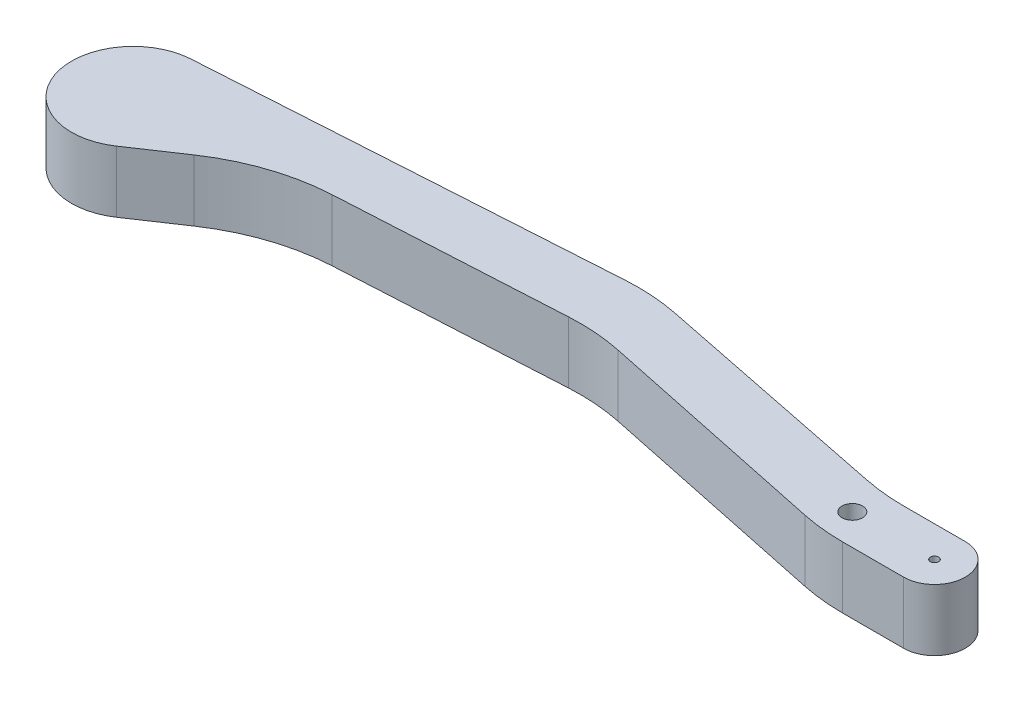
ISO-10303-21;
HEADER;
FILE_DESCRIPTION(('STEP AP214'),'2;1');
FILE_NAME('part.step','',(''),(''),'','','');
FILE_SCHEMA(('AUTOMOTIVE_DESIGN { 1 0 10303 214 1 1 1 1 }'));
ENDSEC;
DATA;
#1=APPLICATION_CONTEXT('core data for automotive mechanical design processes');
#2=APPLICATION_PROTOCOL_DEFINITION('international standard','automotive_design',2000,#1);
#3=PRODUCT_CONTEXT('',#1,'mechanical');
#4=PRODUCT('Part','Part','',(#3));
#5=PRODUCT_RELATED_PRODUCT_CATEGORY('part','',(#4));
#6=PRODUCT_DEFINITION_FORMATION('','',#4);
#7=PRODUCT_DEFINITION_CONTEXT('part definition',#1,'design');
#8=PRODUCT_DEFINITION('design','',#6,#7);
#9=PRODUCT_DEFINITION_SHAPE('','',#8);
#10=(LENGTH_UNIT() NAMED_UNIT(*) SI_UNIT(.MILLI.,.METRE.));
#11=(NAMED_UNIT(*) PLANE_ANGLE_UNIT() SI_UNIT($,.RADIAN.));
#12=(NAMED_UNIT(*) SI_UNIT($,.STERADIAN.) SOLID_ANGLE_UNIT());
#13=UNCERTAINTY_MEASURE_WITH_UNIT(LENGTH_MEASURE(1.E-05),#10,'distance_accuracy_value','');
#14=(GEOMETRIC_REPRESENTATION_CONTEXT(3) GLOBAL_UNCERTAINTY_ASSIGNED_CONTEXT((#13)) GLOBAL_UNIT_ASSIGNED_CONTEXT((#10,
#11,#12)) REPRESENTATION_CONTEXT('',''));
#15=CARTESIAN_POINT('',(0.,0.,0.));
#16=DIRECTION('',(0.,0.,1.));
#17=DIRECTION('',(1.,0.,0.));
#18=AXIS2_PLACEMENT_3D('',#15,#16,#17);
#19=CARTESIAN_POINT('',(-350.,30.,0.));
#20=DIRECTION('',(0.,-1.,0.));
#21=DIRECTION('',(0.,0.,-1.));
#22=AXIS2_PLACEMENT_3D('',#19,#20,#21);
#23=CYLINDRICAL_SURFACE('',#22,30.);
#24=CARTESIAN_POINT('',(-350.,0.,0.));
#25=DIRECTION('',(0.,1.,0.));
#26=DIRECTION('',(0.,0.,1.));
#27=AXIS2_PLACEMENT_3D('',#24,#25,#26);
#28=CIRCLE('',#27,30.);
#29=CARTESIAN_POINT('',(-351.875417006676,0.,-29.9413228006224));
#30=VERTEX_POINT('',#29);
#31=CARTESIAN_POINT('',(-333.28573951652,0.,24.9125168638253));
#32=VERTEX_POINT('',#31);
#33=EDGE_CURVE('E161',#30,#32,#28,.T.);
#34=ORIENTED_EDGE('',*,*,#33,.T.);
#35=DIRECTION('',(0.,-1.,0.));
#36=VECTOR('',#35,1.);
#37=CARTESIAN_POINT('',(-333.28573951652,30.,24.9125168638253));
#38=LINE('',#37,#36);
#39=CARTESIAN_POINT('',(-333.28573951652,30.,24.9125168638253));
#40=VERTEX_POINT('',#39);
#41=EDGE_CURVE('E142',#40,#32,#38,.T.);
#42=ORIENTED_EDGE('',*,*,#41,.F.);
#43=CARTESIAN_POINT('',(-350.,30.,0.));
#44=DIRECTION('',(0.,1.,0.));
#45=DIRECTION('',(0.,0.,1.));
#46=AXIS2_PLACEMENT_3D('',#43,#44,#45);
#47=CIRCLE('',#46,30.);
#48=CARTESIAN_POINT('',(-351.875417006676,30.,-29.9413228006224));
#49=VERTEX_POINT('',#48);
#50=EDGE_CURVE('E148',#49,#40,#47,.T.);
#51=ORIENTED_EDGE('',*,*,#50,.F.);
#52=DIRECTION('',(0.,-1.,0.));
#53=VECTOR('',#52,1.);
#54=CARTESIAN_POINT('',(-351.875417006676,30.,-29.9413228006224));
#55=LINE('',#54,#53);
#56=EDGE_CURVE('E243',#49,#30,#55,.T.);
#57=ORIENTED_EDGE('',*,*,#56,.T.);
#58=EDGE_LOOP('',(#34,#42,#51,#57));
#59=FACE_BOUND('',#58,.T.);
#60=ADVANCED_FACE('F35',(#59),#23,.T.);
#61=CARTESIAN_POINT('',(-91.9282686591511,30.,-137.018598309922));
#62=DIRECTION('',(-0.557142016116002,0.,-0.830417228794175));
#63=DIRECTION('',(-0.830417228794175,0.,0.557142016116002));
#64=AXIS2_PLACEMENT_3D('',#61,#62,#63);
#65=PLANE('',#64);
#66=DIRECTION('',(0.830417228794175,0.,-0.557142016116002));
#67=VECTOR('',#66,1.);
#68=CARTESIAN_POINT('',(-91.9282686591511,0.,-137.018598309922));
#69=LINE('',#68,#67);
#70=CARTESIAN_POINT('',(-310.608396728041,0.,9.69787530385566));
#71=VERTEX_POINT('',#70);
#72=EDGE_CURVE('E211',#32,#71,#69,.T.);
#73=ORIENTED_EDGE('',*,*,#72,.T.);
#74=DIRECTION('',(0.,-1.,0.));
#75=VECTOR('',#74,1.);
#76=CARTESIAN_POINT('',(-310.608396728041,30.,9.69787530385559));
#77=LINE('',#76,#75);
#78=CARTESIAN_POINT('',(-310.608396728041,30.,9.69787530385566));
#79=VERTEX_POINT('',#78);
#80=EDGE_CURVE('E145',#71,#79,#77,.F.);
#81=ORIENTED_EDGE('',*,*,#80,.T.);
#82=DIRECTION('',(0.830417228794175,0.,-0.557142016116002));
#83=VECTOR('',#82,1.);
#84=CARTESIAN_POINT('',(-91.9282686591511,30.,-137.018598309922));
#85=LINE('',#84,#83);
#86=EDGE_CURVE('E137',#40,#79,#85,.T.);
#87=ORIENTED_EDGE('',*,*,#86,.F.);
#88=ORIENTED_EDGE('',*,*,#41,.T.);
#89=EDGE_LOOP('',(#73,#81,#87,#88));
#90=FACE_BOUND('',#89,.T.);
#91=ADVANCED_FACE('F140',(#90),#65,.F.);
#92=CARTESIAN_POINT('',(-1.19004921764275,30.,-21.4737935567704));
#93=DIRECTION('',(-0.0553337702493512,0.,-0.998467913290153));
#94=DIRECTION('',(-0.998467913290153,0.,0.0553337702493512));
#95=AXIS2_PLACEMENT_3D('',#92,#93,#94);
#96=PLANE('',#95);
#97=DIRECTION('',(0.998467913290153,0.,-0.0553337702493512));
#98=VECTOR('',#97,1.);
#99=CARTESIAN_POINT('',(-1.19004921764275,0.,-21.4737935567704));
#100=LINE('',#99,#98);
#101=CARTESIAN_POINT('',(-260.427572141376,0.,-7.1071931457422));
#102=VERTEX_POINT('',#101);
#103=CARTESIAN_POINT('',(-151.198358450132,0.,-13.1605316000468));
#104=VERTEX_POINT('',#103);
#105=EDGE_CURVE('E213',#102,#104,#100,.T.);
#106=ORIENTED_EDGE('',*,*,#105,.T.);
#107=DIRECTION('',(0.,-1.,0.));
#108=VECTOR('',#107,1.);
#109=CARTESIAN_POINT('',(-151.198358450132,30.,-13.1605316000468));
#110=LINE('',#109,#108);
#111=CARTESIAN_POINT('',(-151.198358450132,30.,-13.1605316000468));
#112=VERTEX_POINT('',#111);
#113=EDGE_CURVE('E196',#104,#112,#110,.F.);
#114=ORIENTED_EDGE('',*,*,#113,.T.);
#115=DIRECTION('',(0.998467913290153,0.,-0.0553337702493512));
#116=VECTOR('',#115,1.);
#117=CARTESIAN_POINT('',(-1.19004921764275,30.,-21.4737935567704));
#118=LINE('',#117,#116);
#119=CARTESIAN_POINT('',(-260.427572141376,30.,-7.1071931457422));
#120=VERTEX_POINT('',#119);
#121=EDGE_CURVE('E147',#120,#112,#118,.T.);
#122=ORIENTED_EDGE('',*,*,#121,.F.);
#123=DIRECTION('',(0.,-1.,0.));
#124=VECTOR('',#123,1.);
#125=CARTESIAN_POINT('',(-260.427572141376,0.,-7.10719314574219));
#126=LINE('',#125,#124);
#127=EDGE_CURVE('E193',#120,#102,#126,.T.);
#128=ORIENTED_EDGE('',*,*,#127,.T.);
#129=EDGE_LOOP('',(#106,#114,#122,#128));
#130=FACE_BOUND('',#129,.T.);
#131=ADVANCED_FACE('F221',(#130),#96,.F.);
#132=CARTESIAN_POINT('',(-3.01378585704881,30.,14.3910568491865));
#133=DIRECTION('',(0.20497419413347,0.,-0.978767377745772));
#134=DIRECTION('',(-0.978767377745772,0.,-0.20497419413347));
#135=AXIS2_PLACEMENT_3D('',#132,#133,#134);
#136=PLANE('',#135);
#137=DIRECTION('',(0.978767377745772,0.,0.20497419413347));
#138=VECTOR('',#137,1.);
#139=CARTESIAN_POINT('',(-3.01378585704881,0.,14.3910568491865));
#140=LINE('',#139,#138);
#141=CARTESIAN_POINT('',(-125.16756201185,0.,-11.1904780456087));
#142=VERTEX_POINT('',#141);
#143=CARTESIAN_POINT('',(-10.2447746944077,0.,12.8767377745772));
#144=VERTEX_POINT('',#143);
#145=EDGE_CURVE('E246',#142,#144,#140,.T.);
#146=ORIENTED_EDGE('',*,*,#145,.T.);
#147=DIRECTION('',(0.,-1.,0.));
#148=VECTOR('',#147,1.);
#149=CARTESIAN_POINT('',(-10.2447746944077,30.,12.8767377745772));
#150=LINE('',#149,#148);
#151=CARTESIAN_POINT('',(-10.2447746944077,30.,12.8767377745772));
#152=VERTEX_POINT('',#151);
#153=EDGE_CURVE('E179',#144,#152,#150,.F.);
#154=ORIENTED_EDGE('',*,*,#153,.T.);
#155=DIRECTION('',(0.978767377745772,0.,0.20497419413347));
#156=VECTOR('',#155,1.);
#157=CARTESIAN_POINT('',(-3.01378585704881,30.,14.3910568491865));
#158=LINE('',#157,#156);
#159=CARTESIAN_POINT('',(-125.16756201185,30.,-11.1904780456087));
#160=VERTEX_POINT('',#159);
#161=EDGE_CURVE('E223',#160,#152,#158,.T.);
#162=ORIENTED_EDGE('',*,*,#161,.F.);
#163=DIRECTION('',(0.,-1.,0.));
#164=VECTOR('',#163,1.);
#165=CARTESIAN_POINT('',(-125.16756201185,0.,-11.1904780456087));
#166=LINE('',#165,#164);
#167=EDGE_CURVE('E176',#160,#142,#166,.T.);
#168=ORIENTED_EDGE('',*,*,#167,.T.);
#169=EDGE_LOOP('',(#146,#154,#162,#168));
#170=FACE_BOUND('',#169,.T.);
#171=ADVANCED_FACE('F327',(#170),#136,.F.);
#172=CARTESIAN_POINT('',(0.,30.,15.));
#173=DIRECTION('',(0.,0.,-1.));
#174=DIRECTION('',(-1.,0.,0.));
#175=AXIS2_PLACEMENT_3D('',#172,#173,#174);
#176=PLANE('',#175);
#177=DIRECTION('',(1.,0.,0.));
#178=VECTOR('',#177,1.);
#179=CARTESIAN_POINT('',(0.,30.,15.));
#180=LINE('',#179,#178);
#181=CARTESIAN_POINT('',(10.2526447189393,30.,15.));
#182=VERTEX_POINT('',#181);
#183=CARTESIAN_POINT('',(40.,30.,15.));
#184=VERTEX_POINT('',#183);
#185=EDGE_CURVE('E225',#182,#184,#180,.T.);
#186=ORIENTED_EDGE('',*,*,#185,.F.);
#187=DIRECTION('',(0.,-1.,0.));
#188=VECTOR('',#187,1.);
#189=CARTESIAN_POINT('',(10.2526447189393,30.,15.));
#190=LINE('',#189,#188);
#191=CARTESIAN_POINT('',(10.2526447189393,0.,15.));
#192=VERTEX_POINT('',#191);
#193=EDGE_CURVE('E162',#182,#192,#190,.T.);
#194=ORIENTED_EDGE('',*,*,#193,.T.);
#195=DIRECTION('',(1.,0.,0.));
#196=VECTOR('',#195,1.);
#197=CARTESIAN_POINT('',(0.,0.,15.));
#198=LINE('',#197,#196);
#199=CARTESIAN_POINT('',(40.,0.,15.));
#200=VERTEX_POINT('',#199);
#201=EDGE_CURVE('E249',#192,#200,#198,.T.);
#202=ORIENTED_EDGE('',*,*,#201,.T.);
#203=DIRECTION('',(0.,-1.,0.));
#204=VECTOR('',#203,1.);
#205=CARTESIAN_POINT('',(40.,30.,15.));
#206=LINE('',#205,#204);
#207=EDGE_CURVE('E163',#184,#200,#206,.T.);
#208=ORIENTED_EDGE('',*,*,#207,.F.);
#209=EDGE_LOOP('',(#186,#194,#202,#208));
#210=FACE_BOUND('',#209,.T.);
#211=ADVANCED_FACE('F333',(#210),#176,.F.);
#212=CARTESIAN_POINT('',(40.,30.,0.));
#213=DIRECTION('',(0.,-1.,0.));
#214=DIRECTION('',(0.,0.,-1.));
#215=AXIS2_PLACEMENT_3D('',#212,#213,#214);
#216=CYLINDRICAL_SURFACE('',#215,15.);
#217=CARTESIAN_POINT('',(40.,0.,0.));
#218=DIRECTION('',(0.,1.,0.));
#219=DIRECTION('',(0.,0.,1.));
#220=AXIS2_PLACEMENT_3D('',#217,#218,#219);
#221=CIRCLE('',#220,15.);
#222=CARTESIAN_POINT('',(40.,0.,-15.));
#223=VERTEX_POINT('',#222);
#224=EDGE_CURVE('E251',#200,#223,#221,.T.);
#225=ORIENTED_EDGE('',*,*,#224,.T.);
#226=DIRECTION('',(0.,-1.,0.));
#227=VECTOR('',#226,1.);
#228=CARTESIAN_POINT('',(40.,30.,-15.));
#229=LINE('',#228,#227);
#230=CARTESIAN_POINT('',(40.,30.,-15.));
#231=VERTEX_POINT('',#230);
#232=EDGE_CURVE('E169',#231,#223,#229,.T.);
#233=ORIENTED_EDGE('',*,*,#232,.F.);
#234=CARTESIAN_POINT('',(40.,30.,0.));
#235=DIRECTION('',(0.,1.,0.));
#236=DIRECTION('',(0.,0.,1.));
#237=AXIS2_PLACEMENT_3D('',#234,#235,#236);
#238=CIRCLE('',#237,15.);
#239=EDGE_CURVE('E229',#184,#231,#238,.T.);
#240=ORIENTED_EDGE('',*,*,#239,.F.);
#241=ORIENTED_EDGE('',*,*,#207,.T.);
#242=EDGE_LOOP('',(#225,#233,#240,#241));
#243=FACE_BOUND('',#242,.T.);
#244=ADVANCED_FACE('F275',(#243),#216,.T.);
#245=CARTESIAN_POINT('',(0.,30.,-15.));
#246=DIRECTION('',(0.,0.,-1.));
#247=DIRECTION('',(-1.,0.,0.));
#248=AXIS2_PLACEMENT_3D('',#245,#246,#247);
#249=PLANE('',#248);
#250=DIRECTION('',(1.,0.,0.));
#251=VECTOR('',#250,1.);
#252=CARTESIAN_POINT('',(0.,0.,-15.));
#253=LINE('',#252,#251);
#254=CARTESIAN_POINT('',(9.99532339658441,0.,-15.));
#255=VERTEX_POINT('',#254);
#256=EDGE_CURVE('E254',#255,#223,#253,.T.);
#257=ORIENTED_EDGE('',*,*,#256,.F.);
#258=DIRECTION('',(0.,-1.,0.));
#259=VECTOR('',#258,1.);
#260=CARTESIAN_POINT('',(9.99532339658441,30.,-15.));
#261=LINE('',#260,#259);
#262=CARTESIAN_POINT('',(9.99532339658441,30.,-15.));
#263=VERTEX_POINT('',#262);
#264=EDGE_CURVE('E188',#255,#263,#261,.F.);
#265=ORIENTED_EDGE('',*,*,#264,.T.);
#266=DIRECTION('',(1.,0.,0.));
#267=VECTOR('',#266,1.);
#268=CARTESIAN_POINT('',(0.,30.,-15.));
#269=LINE('',#268,#267);
#270=EDGE_CURVE('E232',#263,#231,#269,.T.);
#271=ORIENTED_EDGE('',*,*,#270,.T.);
#272=ORIENTED_EDGE('',*,*,#232,.T.);
#273=EDGE_LOOP('',(#257,#265,#271,#272));
#274=FACE_BOUND('',#273,.T.);
#275=ADVANCED_FACE('F269',(#274),#249,.T.);
#276=CARTESIAN_POINT('',(2.91019905832324,30.,-14.4123614952442));
#277=DIRECTION('',(-0.197929028485096,0.,0.980216353507197));
#278=DIRECTION('',(0.980216353507197,0.,0.197929028485096));
#279=AXIS2_PLACEMENT_3D('',#276,#277,#278);
#280=PLANE('',#279);
#281=DIRECTION('',(-0.980216353507197,0.,-0.197929028485096));
#282=VECTOR('',#281,1.);
#283=CARTESIAN_POINT('',(2.91019905832324,30.,-14.4123614952442));
#284=LINE('',#283,#282);
#285=CARTESIAN_POINT('',(-9.79757945192518,30.,-16.9783646492803));
#286=VERTEX_POINT('',#285);
#287=CARTESIAN_POINT('',(-126.880148237604,30.,-40.6201239500433));
#288=VERTEX_POINT('',#287);
#289=EDGE_CURVE('E234',#286,#288,#284,.T.);
#290=ORIENTED_EDGE('',*,*,#289,.F.);
#291=DIRECTION('',(0.,-1.,0.));
#292=VECTOR('',#291,1.);
#293=CARTESIAN_POINT('',(-9.79757945192517,30.,-16.9783646492803));
#294=LINE('',#293,#292);
#295=CARTESIAN_POINT('',(-9.79757945192518,0.,-16.9783646492803));
#296=VERTEX_POINT('',#295);
#297=EDGE_CURVE('E185',#286,#296,#294,.T.);
#298=ORIENTED_EDGE('',*,*,#297,.T.);
#299=DIRECTION('',(-0.980216353507197,0.,-0.197929028485096));
#300=VECTOR('',#299,1.);
#301=CARTESIAN_POINT('',(2.91019905832324,0.,-14.4123614952442));
#302=LINE('',#301,#300);
#303=CARTESIAN_POINT('',(-126.880148237604,0.,-40.6201239500433));
#304=VERTEX_POINT('',#303);
#305=EDGE_CURVE('E256',#296,#304,#302,.T.);
#306=ORIENTED_EDGE('',*,*,#305,.T.);
#307=DIRECTION('',(0.,-1.,0.));
#308=VECTOR('',#307,1.);
#309=CARTESIAN_POINT('',(-126.880148237604,30.,-40.6201239500433));
#310=LINE('',#309,#308);
#311=EDGE_CURVE('E58',#304,#288,#310,.F.);
#312=ORIENTED_EDGE('',*,*,#311,.T.);
#313=EDGE_LOOP('',(#290,#298,#306,#312));
#314=FACE_BOUND('',#313,.T.);
#315=ADVANCED_FACE('F282',(#314),#280,.F.);
#316=CARTESIAN_POINT('',(0.,30.,0.));
#317=DIRECTION('',(0.,-1.,0.));
#318=DIRECTION('',(0.,0.,-1.));
#319=AXIS2_PLACEMENT_3D('',#316,#317,#318);
#320=CYLINDRICAL_SURFACE('',#319,5.);
#321=CARTESIAN_POINT('',(0.,30.,0.));
#322=DIRECTION('',(0.,1.,0.));
#323=DIRECTION('',(0.,0.,1.));
#324=AXIS2_PLACEMENT_3D('',#321,#322,#323);
#325=CIRCLE('',#324,5.);
#326=CARTESIAN_POINT('',(0.,30.,5.));
#327=VERTEX_POINT('',#326);
#328=EDGE_CURVE('E237',#327,#327,#325,.T.);
#329=ORIENTED_EDGE('',*,*,#328,.T.);
#330=EDGE_LOOP('',(#329));
#331=FACE_BOUND('',#330,.T.);
#332=CARTESIAN_POINT('',(0.,0.,0.));
#333=DIRECTION('',(0.,1.,0.));
#334=DIRECTION('',(0.,0.,1.));
#335=AXIS2_PLACEMENT_3D('',#332,#333,#334);
#336=CIRCLE('',#335,5.);
#337=CARTESIAN_POINT('',(0.,0.,5.));
#338=VERTEX_POINT('',#337);
#339=EDGE_CURVE('E260',#338,#338,#336,.T.);
#340=ORIENTED_EDGE('',*,*,#339,.F.);
#341=EDGE_LOOP('',(#340));
#342=FACE_BOUND('',#341,.T.);
#343=ADVANCED_FACE('F291',(#331,#342),#320,.F.);
#344=CARTESIAN_POINT('',(-3.24321270903869,30.,-51.778392904997));
#345=DIRECTION('',(0.0625139002225495,0.,0.998044093354079));
#346=DIRECTION('',(0.998044093354079,0.,-0.0625139002225495));
#347=AXIS2_PLACEMENT_3D('',#344,#345,#346);
#348=PLANE('',#347);
#349=DIRECTION('',(-0.998044093354079,0.,0.0625139002225495));
#350=VECTOR('',#349,1.);
#351=CARTESIAN_POINT('',(-3.24321270903869,30.,-51.778392904997));
#352=LINE('',#351,#350);
#353=CARTESIAN_POINT('',(-152.924441108368,30.,-42.4028979347315));
#354=VERTEX_POINT('',#353);
#355=EDGE_CURVE('E154',#354,#49,#352,.T.);
#356=ORIENTED_EDGE('',*,*,#355,.F.);
#357=DIRECTION('',(0.,-1.,0.));
#358=VECTOR('',#357,1.);
#359=CARTESIAN_POINT('',(-152.924441108368,30.,-42.4028979347315));
#360=LINE('',#359,#358);
#361=CARTESIAN_POINT('',(-152.924441108368,0.,-42.4028979347315));
#362=VERTEX_POINT('',#361);
#363=EDGE_CURVE('E190',#354,#362,#360,.T.);
#364=ORIENTED_EDGE('',*,*,#363,.T.);
#365=DIRECTION('',(-0.998044093354079,0.,0.0625139002225495));
#366=VECTOR('',#365,1.);
#367=CARTESIAN_POINT('',(-3.24321270903869,0.,-51.778392904997));
#368=LINE('',#367,#366);
#369=EDGE_CURVE('E258',#362,#30,#368,.T.);
#370=ORIENTED_EDGE('',*,*,#369,.T.);
#371=ORIENTED_EDGE('',*,*,#56,.F.);
#372=EDGE_LOOP('',(#356,#364,#370,#371));
#373=FACE_BOUND('',#372,.T.);
#374=ADVANCED_FACE('F288',(#373),#348,.F.);
#375=CARTESIAN_POINT('',(40.,30.,0.));
#376=DIRECTION('',(0.,-1.,0.));
#377=DIRECTION('',(0.,0.,-1.));
#378=AXIS2_PLACEMENT_3D('',#375,#376,#377);
#379=CYLINDRICAL_SURFACE('',#378,2.);
#380=CARTESIAN_POINT('',(40.,30.,0.));
#381=DIRECTION('',(0.,1.,0.));
#382=DIRECTION('',(0.,0.,1.));
#383=AXIS2_PLACEMENT_3D('',#380,#381,#382);
#384=CIRCLE('',#383,2.);
#385=CARTESIAN_POINT('',(40.,30.,2.));
#386=VERTEX_POINT('',#385);
#387=EDGE_CURVE('E240',#386,#386,#384,.T.);
#388=ORIENTED_EDGE('',*,*,#387,.T.);
#389=EDGE_LOOP('',(#388));
#390=FACE_BOUND('',#389,.T.);
#391=CARTESIAN_POINT('',(40.,0.,0.));
#392=DIRECTION('',(0.,1.,0.));
#393=DIRECTION('',(0.,0.,1.));
#394=AXIS2_PLACEMENT_3D('',#391,#392,#393);
#395=CIRCLE('',#394,2.);
#396=CARTESIAN_POINT('',(40.,0.,2.));
#397=VERTEX_POINT('',#396);
#398=EDGE_CURVE('E158',#397,#397,#395,.T.);
#399=ORIENTED_EDGE('',*,*,#398,.F.);
#400=EDGE_LOOP('',(#399));
#401=FACE_BOUND('',#400,.T.);
#402=ADVANCED_FACE('F290',(#390,#401),#379,.F.);
#403=CARTESIAN_POINT('',(0.,30.,0.));
#404=DIRECTION('',(0.,1.,0.));
#405=DIRECTION('',(0.,0.,1.));
#406=AXIS2_PLACEMENT_3D('',#403,#404,#405);
#407=PLANE('',#406);
#408=ORIENTED_EDGE('',*,*,#161,.T.);
#409=CARTESIAN_POINT('',(10.2526447189393,30.,-85.));
#410=DIRECTION('',(0.,1.,0.));
#411=DIRECTION('',(0.,0.,1.));
#412=AXIS2_PLACEMENT_3D('',#409,#410,#411);
#413=CIRCLE('',#412,100.);
#414=EDGE_CURVE('E182',#152,#182,#413,.T.);
#415=ORIENTED_EDGE('',*,*,#414,.T.);
#416=ORIENTED_EDGE('',*,*,#185,.T.);
#417=ORIENTED_EDGE('',*,*,#239,.T.);
#418=ORIENTED_EDGE('',*,*,#270,.F.);
#419=CARTESIAN_POINT('',(9.99532339658441,30.,-115.));
#420=DIRECTION('',(0.,1.,0.));
#421=DIRECTION('',(0.,0.,1.));
#422=AXIS2_PLACEMENT_3D('',#419,#420,#421);
#423=CIRCLE('',#422,100.);
#424=EDGE_CURVE('E201',#263,#286,#423,.F.);
#425=ORIENTED_EDGE('',*,*,#424,.T.);
#426=ORIENTED_EDGE('',*,*,#289,.T.);
#427=CARTESIAN_POINT('',(-146.673051086113,30.,57.4015114006764));
#428=DIRECTION('',(0.,1.,0.));
#429=DIRECTION('',(0.,0.,1.));
#430=AXIS2_PLACEMENT_3D('',#427,#428,#429);
#431=CIRCLE('',#430,100.);
#432=EDGE_CURVE('E50',#288,#354,#431,.T.);
#433=ORIENTED_EDGE('',*,*,#432,.T.);
#434=ORIENTED_EDGE('',*,*,#355,.T.);
#435=ORIENTED_EDGE('',*,*,#50,.T.);
#436=ORIENTED_EDGE('',*,*,#86,.T.);
#437=CARTESIAN_POINT('',(-254.894195116441,30.,92.7395981832731));
#438=DIRECTION('',(0.,1.,0.));
#439=DIRECTION('',(0.,0.,1.));
#440=AXIS2_PLACEMENT_3D('',#437,#438,#439);
#441=CIRCLE('',#440,100.);
#442=EDGE_CURVE('E11',#79,#120,#441,.F.);
#443=ORIENTED_EDGE('',*,*,#442,.T.);
#444=ORIENTED_EDGE('',*,*,#121,.T.);
#445=CARTESIAN_POINT('',(-145.664981425197,30.,86.6862597289684));
#446=DIRECTION('',(0.,1.,0.));
#447=DIRECTION('',(0.,0.,1.));
#448=AXIS2_PLACEMENT_3D('',#445,#446,#447);
#449=CIRCLE('',#448,100.);
#450=EDGE_CURVE('E205',#112,#160,#449,.F.);
#451=ORIENTED_EDGE('',*,*,#450,.T.);
#452=EDGE_LOOP('',(#408,#415,#416,#417,#418,#425,#426,#433,#434,#435,#436,#443,#444,#451));
#453=FACE_BOUND('',#452,.T.);
#454=ORIENTED_EDGE('',*,*,#328,.F.);
#455=EDGE_LOOP('',(#454));
#456=FACE_BOUND('',#455,.T.);
#457=ORIENTED_EDGE('',*,*,#387,.F.);
#458=EDGE_LOOP('',(#457));
#459=FACE_BOUND('',#458,.T.);
#460=ADVANCED_FACE('F152',(#453,#456,#459),#407,.T.);
#461=CARTESIAN_POINT('',(0.,0.,0.));
#462=DIRECTION('',(0.,1.,0.));
#463=DIRECTION('',(0.,0.,1.));
#464=AXIS2_PLACEMENT_3D('',#461,#462,#463);
#465=PLANE('',#464);
#466=ORIENTED_EDGE('',*,*,#201,.F.);
#467=CARTESIAN_POINT('',(10.2526447189393,0.,-85.));
#468=DIRECTION('',(0.,1.,0.));
#469=DIRECTION('',(0.,0.,1.));
#470=AXIS2_PLACEMENT_3D('',#467,#468,#469);
#471=CIRCLE('',#470,100.);
#472=EDGE_CURVE('E174',#192,#144,#471,.F.);
#473=ORIENTED_EDGE('',*,*,#472,.T.);
#474=ORIENTED_EDGE('',*,*,#145,.F.);
#475=CARTESIAN_POINT('',(-145.664981425197,0.,86.6862597289684));
#476=DIRECTION('',(0.,1.,0.));
#477=DIRECTION('',(0.,0.,1.));
#478=AXIS2_PLACEMENT_3D('',#475,#476,#477);
#479=CIRCLE('',#478,100.);
#480=EDGE_CURVE('E203',#142,#104,#479,.T.);
#481=ORIENTED_EDGE('',*,*,#480,.T.);
#482=ORIENTED_EDGE('',*,*,#105,.F.);
#483=CARTESIAN_POINT('',(-254.894195116441,0.,92.7395981832731));
#484=DIRECTION('',(0.,1.,0.));
#485=DIRECTION('',(0.,0.,1.));
#486=AXIS2_PLACEMENT_3D('',#483,#484,#485);
#487=CIRCLE('',#486,100.);
#488=EDGE_CURVE('E43',#102,#71,#487,.T.);
#489=ORIENTED_EDGE('',*,*,#488,.T.);
#490=ORIENTED_EDGE('',*,*,#72,.F.);
#491=ORIENTED_EDGE('',*,*,#33,.F.);
#492=ORIENTED_EDGE('',*,*,#369,.F.);
#493=CARTESIAN_POINT('',(-146.673051086113,0.,57.4015114006764));
#494=DIRECTION('',(0.,1.,0.));
#495=DIRECTION('',(0.,0.,1.));
#496=AXIS2_PLACEMENT_3D('',#493,#494,#495);
#497=CIRCLE('',#496,100.);
#498=EDGE_CURVE('E166',#362,#304,#497,.F.);
#499=ORIENTED_EDGE('',*,*,#498,.T.);
#500=ORIENTED_EDGE('',*,*,#305,.F.);
#501=CARTESIAN_POINT('',(9.99532339658441,0.,-115.));
#502=DIRECTION('',(0.,1.,0.));
#503=DIRECTION('',(0.,0.,1.));
#504=AXIS2_PLACEMENT_3D('',#501,#502,#503);
#505=CIRCLE('',#504,100.);
#506=EDGE_CURVE('E199',#296,#255,#505,.T.);
#507=ORIENTED_EDGE('',*,*,#506,.T.);
#508=ORIENTED_EDGE('',*,*,#256,.T.);
#509=ORIENTED_EDGE('',*,*,#224,.F.);
#510=EDGE_LOOP('',(#466,#473,#474,#481,#482,#489,#490,#491,#492,#499,#500,#507,#508,#509));
#511=FACE_BOUND('',#510,.T.);
#512=ORIENTED_EDGE('',*,*,#339,.T.);
#513=EDGE_LOOP('',(#512));
#514=FACE_BOUND('',#513,.T.);
#515=ORIENTED_EDGE('',*,*,#398,.T.);
#516=EDGE_LOOP('',(#515));
#517=FACE_BOUND('',#516,.T.);
#518=ADVANCED_FACE('F209',(#511,#514,#517),#465,.F.);
#519=CARTESIAN_POINT('',(10.2526447189393,30.,-85.));
#520=DIRECTION('',(0.,-1.,0.));
#521=DIRECTION('',(0.,0.,-1.));
#522=AXIS2_PLACEMENT_3D('',#519,#520,#521);
#523=CYLINDRICAL_SURFACE('',#522,100.);
#524=ORIENTED_EDGE('',*,*,#414,.F.);
#525=ORIENTED_EDGE('',*,*,#153,.F.);
#526=ORIENTED_EDGE('',*,*,#472,.F.);
#527=ORIENTED_EDGE('',*,*,#193,.F.);
#528=EDGE_LOOP('',(#524,#525,#526,#527));
#529=FACE_BOUND('',#528,.T.);
#530=ADVANCED_FACE('F310',(#529),#523,.T.);
#531=CARTESIAN_POINT('',(9.99532339658441,30.,-115.));
#532=DIRECTION('',(0.,-1.,0.));
#533=DIRECTION('',(0.,0.,-1.));
#534=AXIS2_PLACEMENT_3D('',#531,#532,#533);
#535=CYLINDRICAL_SURFACE('',#534,100.);
#536=ORIENTED_EDGE('',*,*,#424,.F.);
#537=ORIENTED_EDGE('',*,*,#264,.F.);
#538=ORIENTED_EDGE('',*,*,#506,.F.);
#539=ORIENTED_EDGE('',*,*,#297,.F.);
#540=EDGE_LOOP('',(#536,#537,#538,#539));
#541=FACE_BOUND('',#540,.T.);
#542=ADVANCED_FACE('F281',(#541),#535,.F.);
#543=CARTESIAN_POINT('',(-146.673051086113,30.,57.4015114006764));
#544=DIRECTION('',(0.,-1.,0.));
#545=DIRECTION('',(0.,0.,-1.));
#546=AXIS2_PLACEMENT_3D('',#543,#544,#545);
#547=CYLINDRICAL_SURFACE('',#546,100.);
#548=ORIENTED_EDGE('',*,*,#432,.F.);
#549=ORIENTED_EDGE('',*,*,#311,.F.);
#550=ORIENTED_EDGE('',*,*,#498,.F.);
#551=ORIENTED_EDGE('',*,*,#363,.F.);
#552=EDGE_LOOP('',(#548,#549,#550,#551));
#553=FACE_BOUND('',#552,.T.);
#554=ADVANCED_FACE('F285',(#553),#547,.T.);
#555=CARTESIAN_POINT('',(-145.664981425197,30.,86.6862597289684));
#556=DIRECTION('',(0.,1.,0.));
#557=DIRECTION('',(0.,0.,1.));
#558=AXIS2_PLACEMENT_3D('',#555,#556,#557);
#559=CYLINDRICAL_SURFACE('',#558,100.);
#560=ORIENTED_EDGE('',*,*,#450,.F.);
#561=ORIENTED_EDGE('',*,*,#113,.F.);
#562=ORIENTED_EDGE('',*,*,#480,.F.);
#563=ORIENTED_EDGE('',*,*,#167,.F.);
#564=EDGE_LOOP('',(#560,#561,#562,#563));
#565=FACE_BOUND('',#564,.T.);
#566=ADVANCED_FACE('F317',(#565),#559,.F.);
#567=CARTESIAN_POINT('',(-254.894195116441,30.,92.7395981832731));
#568=DIRECTION('',(0.,1.,0.));
#569=DIRECTION('',(0.,0.,1.));
#570=AXIS2_PLACEMENT_3D('',#567,#568,#569);
#571=CYLINDRICAL_SURFACE('',#570,100.);
#572=ORIENTED_EDGE('',*,*,#442,.F.);
#573=ORIENTED_EDGE('',*,*,#80,.F.);
#574=ORIENTED_EDGE('',*,*,#488,.F.);
#575=ORIENTED_EDGE('',*,*,#127,.F.);
#576=EDGE_LOOP('',(#572,#573,#574,#575));
#577=FACE_BOUND('',#576,.T.);
#578=ADVANCED_FACE('F37',(#577),#571,.F.);
#579=CLOSED_SHELL('',(#60,#91,#131,#171,#211,#244,#275,#315,#343,#374,#402,#460,#518,#530,#542,
#554,#566,#578));
#580=MANIFOLD_SOLID_BREP('B2',#579);
#581=ADVANCED_BREP_SHAPE_REPRESENTATION('',(#18,#580),#14);
#582=SHAPE_DEFINITION_REPRESENTATION(#9,#581);
ENDSEC;
END-ISO-10303-21;
